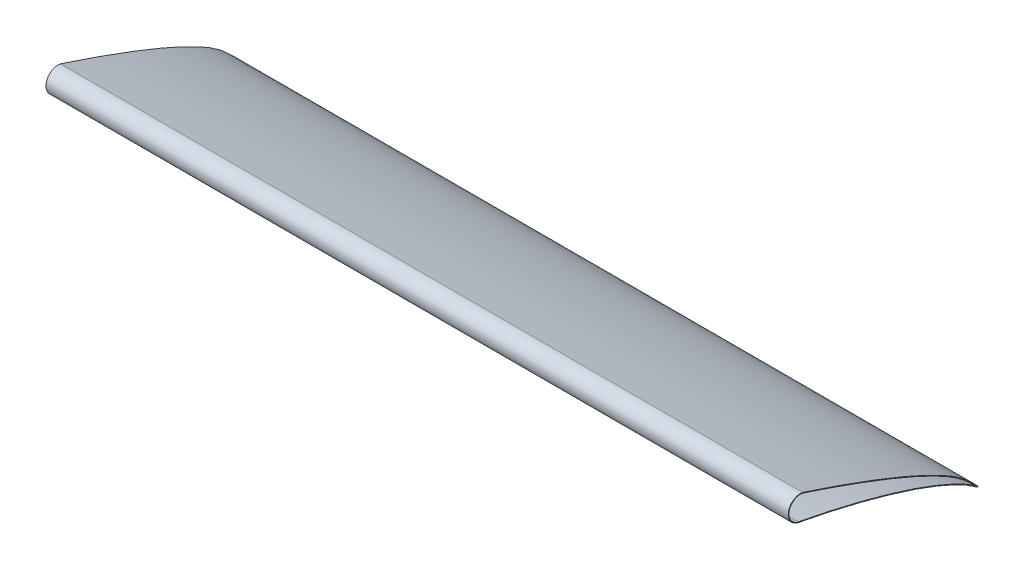
ISO-10303-21;
HEADER;
FILE_DESCRIPTION(('STEP AP214'),'2;1');
FILE_NAME('part.step','',(''),(''),'','','');
FILE_SCHEMA(('AUTOMOTIVE_DESIGN { 1 0 10303 214 1 1 1 1 }'));
ENDSEC;
DATA;
#1=APPLICATION_CONTEXT('core data for automotive mechanical design processes');
#2=APPLICATION_PROTOCOL_DEFINITION('international standard','automotive_design',2000,#1);
#3=PRODUCT_CONTEXT('',#1,'mechanical');
#4=PRODUCT('Part','Part','',(#3));
#5=PRODUCT_RELATED_PRODUCT_CATEGORY('part','',(#4));
#6=PRODUCT_DEFINITION_FORMATION('','',#4);
#7=PRODUCT_DEFINITION_CONTEXT('part definition',#1,'design');
#8=PRODUCT_DEFINITION('design','',#6,#7);
#9=PRODUCT_DEFINITION_SHAPE('','',#8);
#10=(LENGTH_UNIT() NAMED_UNIT(*) SI_UNIT(.MILLI.,.METRE.));
#11=(NAMED_UNIT(*) PLANE_ANGLE_UNIT() SI_UNIT($,.RADIAN.));
#12=(NAMED_UNIT(*) SI_UNIT($,.STERADIAN.) SOLID_ANGLE_UNIT());
#13=UNCERTAINTY_MEASURE_WITH_UNIT(LENGTH_MEASURE(1.E-05),#10,'distance_accuracy_value','');
#14=(GEOMETRIC_REPRESENTATION_CONTEXT(3) GLOBAL_UNCERTAINTY_ASSIGNED_CONTEXT((#13)) GLOBAL_UNIT_ASSIGNED_CONTEXT((#10,
#11,#12)) REPRESENTATION_CONTEXT('',''));
#15=CARTESIAN_POINT('',(0.,0.,0.));
#16=DIRECTION('',(0.,0.,1.));
#17=DIRECTION('',(1.,0.,0.));
#18=AXIS2_PLACEMENT_3D('',#15,#16,#17);
#19=CARTESIAN_POINT('',(764.54,-47.1529999413381,-645.006255561596));
#20=CARTESIAN_POINT('',(764.54,-46.8184129896161,-644.788009956468));
#21=CARTESIAN_POINT('',(764.54,-43.1306984629148,-640.701877001338));
#22=CARTESIAN_POINT('',(764.54,-39.4979946661954,-637.266948450529));
#23=CARTESIAN_POINT('',(764.54,-34.816728887082,-631.439943114749));
#24=CARTESIAN_POINT('',(764.54,-30.6051920119271,-624.753246516577));
#25=CARTESIAN_POINT('',(764.54,-26.2269590885202,-616.590234045585));
#26=CARTESIAN_POINT('',(764.54,-21.5976951529234,-606.898034971643));
#27=CARTESIAN_POINT('',(764.54,-16.6662217200038,-595.54713057427));
#28=CARTESIAN_POINT('',(764.54,-11.5121807979911,-582.685138375436));
#29=CARTESIAN_POINT('',(764.54,-6.23597283905796,-568.6038313187));
#30=CARTESIAN_POINT('',(764.54,-0.949303953276355,-553.667863853133));
#31=CARTESIAN_POINT('',(764.54,4.24867865050638,-538.206016680504));
#32=CARTESIAN_POINT('',(764.54,9.28277497005098,-522.465374532042));
#33=CARTESIAN_POINT('',(764.54,14.0946613985757,-506.597856331795));
#34=CARTESIAN_POINT('',(764.54,18.646906804061,-490.673471292505));
#35=CARTESIAN_POINT('',(764.54,22.9205089715268,-474.696934331045));
#36=CARTESIAN_POINT('',(764.54,26.91891487963,-458.629391952476));
#37=CARTESIAN_POINT('',(764.54,30.6578125592773,-442.405486907504));
#38=CARTESIAN_POINT('',(764.54,34.1705436576163,-425.949677688687));
#39=CARTESIAN_POINT('',(764.54,37.4977537886313,-409.193354533909));
#40=CARTESIAN_POINT('',(764.54,40.6930315626959,-392.099017640712));
#41=CARTESIAN_POINT('',(764.54,43.806237245543,-374.683246306306));
#42=CARTESIAN_POINT('',(764.54,46.874099431523,-357.03326536789));
#43=CARTESIAN_POINT('',(764.54,49.9022352532873,-339.309521150858));
#44=CARTESIAN_POINT('',(764.54,52.8613295143793,-321.730739173725));
#45=CARTESIAN_POINT('',(764.54,55.6750799388608,-304.550789958391));
#46=CARTESIAN_POINT('',(764.54,58.2441239309724,-288.040868648024));
#47=CARTESIAN_POINT('',(764.54,60.4580640802467,-272.443246647622));
#48=CARTESIAN_POINT('',(764.54,62.186715094106,-257.883007269268));
#49=CARTESIAN_POINT('',(764.54,63.3052473833036,-244.324039865457));
#50=CARTESIAN_POINT('',(764.54,63.7580770949073,-231.619659759733));
#51=CARTESIAN_POINT('',(764.54,63.5460195668556,-219.604957351917));
#52=CARTESIAN_POINT('',(764.54,62.6730635261331,-208.152298555875));
#53=CARTESIAN_POINT('',(764.54,61.1482744177689,-197.181322999887));
#54=CARTESIAN_POINT('',(764.54,58.9873404123107,-186.651773362443));
#55=CARTESIAN_POINT('',(764.54,56.2199721328174,-176.559997159896));
#56=CARTESIAN_POINT('',(764.54,52.881387141576,-166.942351020571));
#57=CARTESIAN_POINT('',(764.54,49.0504929712525,-157.873016706743));
#58=CARTESIAN_POINT('',(764.54,44.852310699452,-149.46664758464));
#59=CARTESIAN_POINT('',(764.54,40.46695814702,-141.853978947899));
#60=CARTESIAN_POINT('',(764.54,36.0850702190668,-135.147162117547));
#61=CARTESIAN_POINT('',(764.54,31.8729591824074,-129.387856040399));
#62=CARTESIAN_POINT('',(764.54,27.9151272600017,-124.548517842199));
#63=CARTESIAN_POINT('',(764.54,24.2325830860826,-120.541805747626));
#64=CARTESIAN_POINT('',(764.54,20.8130756742838,-117.252298406315));
#65=CARTESIAN_POINT('',(764.54,17.6401364072634,-114.558316512703));
#66=CARTESIAN_POINT('',(764.54,14.6947160118963,-112.353345163792));
#67=CARTESIAN_POINT('',(764.54,11.9535346341336,-110.555147126191));
#68=CARTESIAN_POINT('',(764.54,9.3931319857351,-109.100632431871));
#69=CARTESIAN_POINT('',(764.54,6.98852010711054,-107.949100641777));
#70=CARTESIAN_POINT('',(764.54,4.72084679731322,-107.067094982468));
#71=CARTESIAN_POINT('',(764.54,2.57320803774997,-106.438867949493));
#72=CARTESIAN_POINT('',(764.54,0.522315990334814,-106.057904943654));
#73=CARTESIAN_POINT('',(764.54,-1.4744993385527,-105.940192606176));
#74=CARTESIAN_POINT('',(764.54,-3.45401879542511,-106.208863531927));
#75=CARTESIAN_POINT('',(764.54,-5.27778203111289,-107.198129964763));
#76=CARTESIAN_POINT('',(764.54,-6.60555803889911,-108.898568130463));
#77=CARTESIAN_POINT('',(764.54,-7.51930683506491,-110.997800005891));
#78=CARTESIAN_POINT('',(764.54,-8.21118510611895,-113.419231546304));
#79=CARTESIAN_POINT('',(764.54,-8.77087461847364,-116.191322027118));
#80=CARTESIAN_POINT('',(764.54,-9.25491154756014,-119.392616546927));
#81=CARTESIAN_POINT('',(764.54,-9.69487553766679,-123.148071420133));
#82=CARTESIAN_POINT('',(764.54,-10.0952008259956,-127.643208841774));
#83=CARTESIAN_POINT('',(764.54,-10.4568280036261,-133.144545660416));
#84=CARTESIAN_POINT('',(764.54,-10.7691817623975,-140.01723365371));
#85=CARTESIAN_POINT('',(764.54,-11.010880296537,-148.675291787275));
#86=CARTESIAN_POINT('',(764.54,-11.1538134096261,-159.393445292688));
#87=CARTESIAN_POINT('',(764.54,-11.1322112495051,-172.099403693975));
#88=CARTESIAN_POINT('',(764.54,-10.8228945304688,-186.422500355236));
#89=CARTESIAN_POINT('',(764.54,-10.1212020176183,-201.960353907518));
#90=CARTESIAN_POINT('',(764.54,-9.0693879399111,-218.458739251688));
#91=CARTESIAN_POINT('',(764.54,-7.81124942101105,-235.740022213801));
#92=CARTESIAN_POINT('',(764.54,-6.44542220841076,-253.568303180533));
#93=CARTESIAN_POINT('',(764.54,-5.03382838171823,-271.65108974034));
#94=CARTESIAN_POINT('',(764.54,-3.63687971673737,-289.732991130569));
#95=CARTESIAN_POINT('',(764.54,-2.3125169514345,-307.638722864199));
#96=CARTESIAN_POINT('',(764.54,-1.10651638675471,-325.286307147841));
#97=CARTESIAN_POINT('',(764.54,-0.0662737166827977,-342.652435014441));
#98=CARTESIAN_POINT('',(764.54,0.773081287344189,-359.740128928665));
#99=CARTESIAN_POINT('',(764.54,1.37440620042548,-376.564409300323));
#100=CARTESIAN_POINT('',(764.54,1.70781888289015,-393.150169947285));
#101=CARTESIAN_POINT('',(764.54,1.75165040824774,-409.522858559904));
#102=CARTESIAN_POINT('',(764.54,1.48275855982936,-425.70995366449));
#103=CARTESIAN_POINT('',(764.54,0.888689421513576,-441.73383152197));
#104=CARTESIAN_POINT('',(764.54,-0.0466079173790058,-457.617389676548));
#105=CARTESIAN_POINT('',(764.54,-1.3317667080149,-473.377742702764));
#106=CARTESIAN_POINT('',(764.54,-2.97531977636997,-489.029743962823));
#107=CARTESIAN_POINT('',(764.54,-4.97914261694881,-504.575689139233));
#108=CARTESIAN_POINT('',(764.54,-7.34483277729503,-520.006592123799));
#109=CARTESIAN_POINT('',(764.54,-10.064545431703,-535.287551638364));
#110=CARTESIAN_POINT('',(764.54,-13.1267972971055,-550.344891007504));
#111=CARTESIAN_POINT('',(764.54,-16.4920742497173,-565.042082165484));
#112=CARTESIAN_POINT('',(764.54,-20.1085820143676,-579.151728774344));
#113=CARTESIAN_POINT('',(764.54,-23.8909030748361,-592.381523343565));
#114=CARTESIAN_POINT('',(764.54,-27.7206085395647,-604.391603146741));
#115=CARTESIAN_POINT('',(764.54,-31.5911859545367,-615.041484305705));
#116=CARTESIAN_POINT('',(764.54,-35.2482553349965,-624.006670800554));
#117=CARTESIAN_POINT('',(764.54,-39.3296543312368,-632.144488556374));
#118=CARTESIAN_POINT('',(764.54,-41.9859552947128,-637.598909850903));
#119=CARTESIAN_POINT('',(764.54,-47.7362536832473,-645.386702453477));
#120=CARTESIAN_POINT('',(764.54,-47.1529999413381,-645.006255561596));
#121=B_SPLINE_CURVE_WITH_KNOTS('',3,(#19,#20,#21,#22,#23,#24,#25,#26,#27,#28,#29,#30,#31,#32,
#33,#34,#35,#36,#37,#38,#39,#40,#41,#42,#43,#44,#45,#46,#47,#48,#49,#50,#51,#52,#53,#54,#55,#56,
#57,#58,#59,#60,#61,#62,#63,#64,#65,#66,#67,#68,#69,#70,#71,#72,#73,#74,#75,#76,#77,#78,#79,#80,
#81,#82,#83,#84,#85,#86,#87,#88,#89,#90,#91,#92,#93,#94,#95,#96,#97,#98,#99,#100,#101,#102,#103,
#104,#105,#106,#107,#108,#109,#110,#111,#112,#113,#114,#115,#116,#117,#118,#119,#120),
.UNSPECIFIED.,.T.,.F.,(4,1,1,1,1,1,1,1,1,1,1,1,1,1,1,1,1,1,1,1,1,1,1,1,1,1,1,1,1,1,1,1,1,1,1,1,
1,1,1,1,1,1,1,1,1,1,1,1,1,1,1,1,1,1,1,1,1,1,1,1,1,1,1,1,1,1,1,1,1,1,1,1,1,1,1,1,1,1,1,1,1,1,1,1,
1,1,1,1,1,1,1,1,1,1,1,1,1,1,1,4),(0.,0.00393243627204213,0.00966229958679102,0.0158580743520423,
0.0227759172876729,0.0308105377004699,0.040258451968964,0.0512101553734172,0.0635309254201197,
0.0769094272086791,0.0909824552528969,0.105438882288591,0.12005583883515,0.134694664133086,
0.149296508411322,0.163863463798656,0.178438522119036,0.193091444582364,0.207900805868289,
0.222945458506345,0.238278447799781,0.253900272542151,0.269742654955101,0.285665129167613,
0.301461442535721,0.316895213216797,0.331713796573279,0.345657403328602,0.358564777269519,
0.370492871938983,0.381634254168821,0.392176896215565,0.402261883473533,0.411997635220679,
0.421456053439548,0.430674693489293,0.439657230914039,0.448365559098678,0.456698480814776,
0.464496219365899,0.471591337620358,0.477879417429047,0.48336118210472,0.488119435275692,
0.492265586775502,0.495903994580303,0.499122498538387,0.501991801966659,0.504570111683674,
0.506905890065342,0.509037948269525,0.510999246223084,0.512816550490772,0.514543833236563,
0.516275553758877,0.518034092640334,0.519877573234174,0.521868418874192,0.524063688354164,
0.526527900779738,0.529344621975955,0.532625657243875,0.536528130378445,0.541280690338968,
0.547207803698655,0.554725076607436,0.564190483291477,0.575560473512985,0.588332609287316,
0.602082710528579,0.616698831029917,0.632060539263214,0.647915036171109,0.663995366327359,
0.680037668885217,0.695886794717843,0.71148786711782,0.726826596533268,0.741904372240097,
0.756740718002256,0.771356109874098,0.785782995965424,0.800046572279944,0.814176416038573,
0.828194452350353,0.842130217180752,0.855999547680395,0.869820095466402,0.883587785644631,
0.897289500021316,0.910871530658389,0.924228261772924,0.937166440672137,0.949399836984198,
0.960605240168519,0.970553551460057,0.979208760733245,0.986686331825572,0.993144956314993,1.),.UNSPECIFIED.);
#122=DIRECTION('',(-1.,0.,0.));
#123=VECTOR('',#122,1.);
#124=SURFACE_OF_LINEAR_EXTRUSION('',#121,#123);
#125=DIRECTION('',(1.,0.,0.));
#126=VECTOR('',#125,1.);
#127=CARTESIAN_POINT('',(307.33,5.15406600738185,-535.301768996159));
#128=LINE('',#127,#126);
#129=CARTESIAN_POINT('',(307.34,5.15406600738085,-535.301768996162));
#130=VERTEX_POINT('',#129);
#131=CARTESIAN_POINT('',(764.54,5.15406600738099,-535.301768996161));
#132=VERTEX_POINT('',#131);
#133=EDGE_CURVE('E145',#130,#132,#128,.T.);
#134=ORIENTED_EDGE('',*,*,#133,.T.);
#135=CARTESIAN_POINT('',(764.54,-45.3771271395738,-643.20196177503));
#136=VERTEX_POINT('',#135);
#137=EDGE_CURVE('E155',#136,#132,#121,.T.);
#138=ORIENTED_EDGE('',*,*,#137,.F.);
#139=DIRECTION('',(-1.,0.,0.));
#140=VECTOR('',#139,1.);
#141=CARTESIAN_POINT('',(764.54,-45.3771271395738,-643.20196177503));
#142=LINE('',#141,#140);
#143=CARTESIAN_POINT('',(307.34,-45.3771271395406,-643.201961774998));
#144=VERTEX_POINT('',#143);
#145=EDGE_CURVE('E136',#136,#144,#142,.T.);
#146=ORIENTED_EDGE('',*,*,#145,.T.);
#147=CARTESIAN_POINT('',(307.34,-46.8489354685635,-644.740736110317));
#148=CARTESIAN_POINT('',(307.34,-46.5180751287745,-644.420979690167));
#149=CARTESIAN_POINT('',(307.34,-45.5965792353619,-643.441416831579));
#150=CARTESIAN_POINT('',(307.34,-43.1964585909459,-640.850684576139));
#151=CARTESIAN_POINT('',(307.34,-41.3512975641284,-639.019352002714));
#152=CARTESIAN_POINT('',(307.34,-38.5451961095666,-636.080952496578));
#153=CARTESIAN_POINT('',(307.34,-36.5008641143958,-633.536270351609));
#154=CARTESIAN_POINT('',(307.34,-33.5552586122208,-629.437094927578));
#155=CARTESIAN_POINT('',(307.34,-31.3912407268852,-625.996253432822));
#156=CARTESIAN_POINT('',(307.34,-28.6535702116708,-621.114538075786));
#157=CARTESIAN_POINT('',(307.34,-25.6950879725233,-615.456264660556));
#158=CARTESIAN_POINT('',(307.34,-23.4850897501488,-610.849636008414));
#159=CARTESIAN_POINT('',(307.34,-20.2703863519754,-603.842932777483));
#160=CARTESIAN_POINT('',(307.34,-18.0193080212363,-598.6615655308));
#161=CARTESIAN_POINT('',(307.34,-14.6560264223192,-590.530655806574));
#162=CARTESIAN_POINT('',(307.34,-11.8109066918377,-583.369653581975));
#163=CARTESIAN_POINT('',(307.34,-8.8082789822882,-575.46888154581));
#164=CARTESIAN_POINT('',(307.34,-5.26669595491397,-565.860075771104));
#165=CARTESIAN_POINT('',(307.34,-2.81895971659347,-558.950040258737));
#166=CARTESIAN_POINT('',(307.34,0.702202402456493,-548.755315885315));
#167=CARTESIAN_POINT('',(307.34,3.20061997796362,-541.323557514714));
#168=CARTESIAN_POINT('',(307.34,6.59502484470291,-530.869447521932));
#169=CARTESIAN_POINT('',(307.34,9.79619154958835,-520.753668360204));
#170=CARTESIAN_POINT('',(307.34,12.3619590180452,-512.311558632767));
#171=CARTESIAN_POINT('',(307.34,15.4921098623097,-501.709388020695));
#172=CARTESIAN_POINT('',(307.34,17.9069340604933,-493.261998456034));
#173=CARTESIAN_POINT('',(307.34,20.8008917130223,-482.620962386919));
#174=CARTESIAN_POINT('',(307.34,23.6003143241723,-471.965145322161));
#175=CARTESIAN_POINT('',(307.34,25.7929086813406,-463.154233283087));
#176=CARTESIAN_POINT('',(307.34,28.353325740555,-452.405165563558));
#177=CARTESIAN_POINT('',(307.34,30.6148944277358,-442.534227501143));
#178=CARTESIAN_POINT('',(307.34,32.7718784757674,-432.501892119331));
#179=CARTESIAN_POINT('',(307.34,35.0638968914343,-421.450618450534));
#180=CARTESIAN_POINT('',(307.34,36.876436940818,-412.322398229232));
#181=CARTESIAN_POINT('',(307.34,39.0217458199563,-401.040187564366));
#182=CARTESIAN_POINT('',(307.34,41.1517150509352,-389.533068725079));
#183=CARTESIAN_POINT('',(307.34,42.779996653935,-380.424200582474));
#184=CARTESIAN_POINT('',(307.34,44.8445490418792,-368.70964570025));
#185=CARTESIAN_POINT('',(307.34,46.4294291084398,-359.589497527944));
#186=CARTESIAN_POINT('',(307.34,48.4330557712671,-347.90866031796));
#187=CARTESIAN_POINT('',(307.34,50.4446482215248,-336.08726512624));
#188=CARTESIAN_POINT('',(307.34,51.9151861235999,-327.35139431956));
#189=CARTESIAN_POINT('',(307.34,53.8483694089172,-315.704158026325));
#190=CARTESIAN_POINT('',(307.34,55.24927189864,-307.145601137022));
#191=CARTESIAN_POINT('',(307.34,57.0085341485594,-295.981367192296));
#192=CARTESIAN_POINT('',(307.34,58.6429244389458,-285.231244558151));
#193=CARTESIAN_POINT('',(307.34,59.7885611932577,-277.160019575226));
#194=CARTESIAN_POINT('',(307.34,61.0932833860575,-267.092863559187));
#195=CARTESIAN_POINT('',(307.34,62.0131881201954,-259.315219459929));
#196=CARTESIAN_POINT('',(307.34,62.8307096660101,-250.076436557802));
#197=CARTESIAN_POINT('',(307.34,63.4104153411277,-241.373496478169));
#198=CARTESIAN_POINT('',(307.34,63.6684283618713,-234.134802983115));
#199=CARTESIAN_POINT('',(307.34,63.6577542625057,-225.935593803252));
#200=CARTESIAN_POINT('',(307.34,63.4342298159956,-218.138342982156));
#201=CARTESIAN_POINT('',(307.34,62.9220014793444,-211.418214944007));
#202=CARTESIAN_POINT('',(307.34,62.0917670224829,-203.969825256883));
#203=CARTESIAN_POINT('',(307.34,61.156001626319,-197.410540265928));
#204=CARTESIAN_POINT('',(307.34,59.8160892048655,-190.69000475967));
#205=CARTESIAN_POINT('',(307.34,58.2089098307214,-183.813066538768));
#206=CARTESIAN_POINT('',(307.34,56.7043554017292,-178.326400129222));
#207=CARTESIAN_POINT('',(307.34,54.5624588583164,-171.785107142956));
#208=CARTESIAN_POINT('',(307.34,52.2717761898825,-165.499146046362));
#209=CARTESIAN_POINT('',(307.34,50.2640746402727,-160.746073853228));
#210=CARTESIAN_POINT('',(307.34,47.5636228690918,-154.895733181123));
#211=CARTESIAN_POINT('',(307.34,45.4777849042349,-150.72250598631));
#212=CARTESIAN_POINT('',(307.34,42.5236449797171,-145.424245000554));
#213=CARTESIAN_POINT('',(307.34,39.6443688317309,-140.595669987702));
#214=CARTESIAN_POINT('',(307.34,37.3912467258618,-137.146365822256));
#215=CARTESIAN_POINT('',(307.34,34.5066202780384,-132.988915039367));
#216=CARTESIAN_POINT('',(307.34,32.3711918225743,-130.069099779553));
#217=CARTESIAN_POINT('',(307.34,29.5888887795659,-126.595067118445));
#218=CARTESIAN_POINT('',(307.34,27.0831194328775,-123.643269821733));
#219=CARTESIAN_POINT('',(307.34,24.9467190714752,-121.318805874361));
#220=CARTESIAN_POINT('',(307.34,22.5655865427282,-118.938183732249));
#221=CARTESIAN_POINT('',(307.34,20.4219556852453,-116.920218249708));
#222=CARTESIAN_POINT('',(307.34,18.350327642243,-115.161303890345));
#223=CARTESIAN_POINT('',(307.34,16.309450284396,-113.5621514899));
#224=CARTESIAN_POINT('',(307.34,14.5143375951564,-112.239750512852));
#225=CARTESIAN_POINT('',(307.34,12.8300163817513,-111.130113734145));
#226=CARTESIAN_POINT('',(307.34,11.6587021136608,-110.413343820119));
#227=CARTESIAN_POINT('',(307.34,10.7588577613882,-109.876474548087));
#228=CARTESIAN_POINT('',(307.34,9.13294863281832,-108.97603461016));
#229=CARTESIAN_POINT('',(307.34,7.04396698068917,-107.975653300089));
#230=CARTESIAN_POINT('',(307.34,5.46993998019822,-107.358452835382));
#231=CARTESIAN_POINT('',(307.34,4.00519825955557,-106.857753557833));
#232=CARTESIAN_POINT('',(307.34,2.57320803774997,-106.438867949493));
#233=CARTESIAN_POINT('',(307.34,0.522315990334814,-106.057904943654));
#234=CARTESIAN_POINT('',(307.34,-1.4744993385527,-105.940192606176));
#235=CARTESIAN_POINT('',(307.34,-2.84557432610392,-106.126282207317));
#236=CARTESIAN_POINT('',(307.34,-4.09908411151578,-106.558767210051));
#237=CARTESIAN_POINT('',(307.34,-5.31453809206499,-107.245202218288));
#238=CARTESIAN_POINT('',(307.34,-6.60555803889911,-108.898568130463));
#239=CARTESIAN_POINT('',(307.34,-7.51930683506491,-110.997800005891));
#240=CARTESIAN_POINT('',(307.34,-8.09536776940686,-113.013894706322));
#241=CARTESIAN_POINT('',(307.34,-8.47666707325876,-114.734139218667));
#242=CARTESIAN_POINT('',(307.34,-8.84724991141747,-116.696448376075));
#243=CARTESIAN_POINT('',(307.34,-9.25491154756014,-119.392616546927));
#244=CARTESIAN_POINT('',(307.34,-9.6625054699151,-122.871766241941));
#245=CARTESIAN_POINT('',(307.34,-9.91112736145998,-125.576300897438));
#246=CARTESIAN_POINT('',(307.34,-10.173733116757,-128.837899421858));
#247=CARTESIAN_POINT('',(307.34,-10.4568280036261,-133.144545660416));
#248=CARTESIAN_POINT('',(307.34,-10.6449037091707,-137.282756285479));
#249=CARTESIAN_POINT('',(307.34,-10.8346367511221,-142.361944181339));
#250=CARTESIAN_POINT('',(307.34,-10.9723705316371,-147.338233166872));
#251=CARTESIAN_POINT('',(307.34,-11.0772611886342,-153.653008818323));
#252=CARTESIAN_POINT('',(307.34,-11.1458960271132,-161.066720821696));
#253=CARTESIAN_POINT('',(307.34,-11.1412079668867,-166.807714522238));
#254=CARTESIAN_POINT('',(307.34,-11.0493929165808,-175.934356397132));
#255=CARTESIAN_POINT('',(307.34,-10.927836027078,-181.563121255415));
#256=CARTESIAN_POINT('',(307.34,-10.5897850100902,-191.584336234846));
#257=CARTESIAN_POINT('',(307.34,-10.2998547358607,-197.922184505404));
#258=CARTESIAN_POINT('',(307.34,-9.7175637172135,-208.291682191563));
#259=CARTESIAN_POINT('',(307.34,-9.22513392389633,-215.90653050468));
#260=CARTESIAN_POINT('',(307.34,-8.51531946870702,-226.069200172663));
#261=CARTESIAN_POINT('',(307.34,-7.84688831748775,-235.165686994193));
#262=CARTESIAN_POINT('',(307.34,-7.11452963116846,-244.834376209537));
#263=CARTESIAN_POINT('',(307.34,-6.27665569457217,-255.714610502692));
#264=CARTESIAN_POINT('',(307.34,-5.59614972107642,-264.447645969645));
#265=CARTESIAN_POINT('',(307.34,-4.65495952484421,-276.555113403886));
#266=CARTESIAN_POINT('',(307.34,-4.02294785346407,-284.735781030299));
#267=CARTESIAN_POINT('',(307.34,-3.11726553211509,-296.758311109803));
#268=CARTESIAN_POINT('',(307.34,-2.40297505267292,-306.476627734492));
#269=CARTESIAN_POINT('',(307.34,-1.64814085994517,-317.360636281137));
#270=CARTESIAN_POINT('',(307.34,-0.882124068142321,-329.032380837585));
#271=CARTESIAN_POINT('',(307.34,-0.328397029265224,-338.276468623053));
#272=CARTESIAN_POINT('',(307.34,0.282817815353455,-349.759283986406));
#273=CARTESIAN_POINT('',(307.34,0.804905519601347,-360.736212942274));
#274=CARTESIAN_POINT('',(307.34,1.16561355299803,-370.722665571696));
#275=CARTESIAN_POINT('',(307.34,1.48071069746524,-381.852573297456));
#276=CARTESIAN_POINT('',(307.34,1.68107503528884,-391.819785476559));
#277=CARTESIAN_POINT('',(307.34,1.73365135764192,-402.799550427509));
#278=CARTESIAN_POINT('',(307.34,1.68315773744507,-413.646067882802));
#279=CARTESIAN_POINT('',(307.34,1.51479967306971,-423.781101784713));
#280=CARTESIAN_POINT('',(307.34,1.15651558385911,-434.509733457174));
#281=CARTESIAN_POINT('',(307.34,0.68805835184342,-445.141021011565));
#282=CARTESIAN_POINT('',(307.34,0.0918643468985341,-455.265803532774));
#283=CARTESIAN_POINT('',(307.34,-0.714129095763692,-465.803436023873));
#284=CARTESIAN_POINT('',(307.34,-1.63600052128334,-476.275043751519));
#285=CARTESIAN_POINT('',(307.34,-2.67799098692464,-486.198201327143));
#286=CARTESIAN_POINT('',(307.34,-3.94971742169681,-496.589260736221));
#287=CARTESIAN_POINT('',(307.34,-5.33953777697722,-506.926471521357));
#288=CARTESIAN_POINT('',(307.34,-6.79806173419696,-516.440118769747));
#289=CARTESIAN_POINT('',(307.34,-8.53247079141915,-526.679447207359));
#290=CARTESIAN_POINT('',(307.34,-10.3778919836615,-536.828301903322));
#291=CARTESIAN_POINT('',(307.34,-12.1873527621983,-545.725566470421));
#292=CARTESIAN_POINT('',(307.34,-14.3480261795174,-555.678370119386));
#293=CARTESIAN_POINT('',(307.34,-16.2914652017081,-564.132046476375));
#294=CARTESIAN_POINT('',(307.34,-18.6455310254729,-573.443699435702));
#295=CARTESIAN_POINT('',(307.34,-21.1051915971516,-582.637667655565));
#296=CARTESIAN_POINT('',(307.34,-23.1428044760804,-589.76482565428));
#297=CARTESIAN_POINT('',(307.34,-25.7541731398798,-598.224798337464));
#298=CARTESIAN_POINT('',(307.34,-28.1876557746557,-605.660356978736));
#299=CARTESIAN_POINT('',(307.34,-30.4080391460753,-611.786059713245));
#300=CARTESIAN_POINT('',(307.34,-32.9220925658674,-618.304158522815));
#301=CARTESIAN_POINT('',(307.34,-34.7994867456047,-622.906529217672));
#302=CARTESIAN_POINT('',(307.34,-37.5846253430109,-628.665111044426));
#303=CARTESIAN_POINT('',(307.34,-39.8760981003344,-633.266550616137));
#304=CARTESIAN_POINT('',(307.34,-41.1124416316672,-635.805245808202));
#305=CARTESIAN_POINT('',(307.34,-44.474476816495,-640.91782234182));
#306=CARTESIAN_POINT('',(307.34,-47.2525654573774,-644.732525783319));
#307=CARTESIAN_POINT('',(307.34,-47.2478173623462,-645.104820175898));
#308=CARTESIAN_POINT('',(307.34,-46.9854295705903,-644.872649368531));
#309=CARTESIAN_POINT('',(307.34,-46.8489354685635,-644.740736110317));
#310=B_SPLINE_CURVE_WITH_KNOTS('',3,(#147,#148,#149,#150,#151,#152,#153,#154,#155,#156,#157,
#158,#159,#160,#161,#162,#163,#164,#165,#166,#167,#168,#169,#170,#171,#172,#173,#174,#175,#176,
#177,#178,#179,#180,#181,#182,#183,#184,#185,#186,#187,#188,#189,#190,#191,#192,#193,#194,#195,
#196,#197,#198,#199,#200,#201,#202,#203,#204,#205,#206,#207,#208,#209,#210,#211,#212,#213,#214,
#215,#216,#217,#218,#219,#220,#221,#222,#223,#224,#225,#226,#227,#228,#229,#230,#231,#232,#233,
#234,#235,#236,#237,#238,#239,#240,#241,#242,#243,#244,#245,#246,#247,#248,#249,#250,#251,#252,
#253,#254,#255,#256,#257,#258,#259,#260,#261,#262,#263,#264,#265,#266,#267,#268,#269,#270,#271,
#272,#273,#274,#275,#276,#277,#278,#279,#280,#281,#282,#283,#284,#285,#286,#287,#288,#289,#290,
#291,#292,#293,#294,#295,#296,#297,#298,#299,#300,#301,#302,#303,#304,#305,#306,#307,#308,#309),
.UNSPECIFIED.,.T.,.F.,(4,1,1,1,1,1,1,1,1,1,1,1,1,1,1,1,1,1,1,1,1,1,1,1,1,1,1,1,1,1,1,1,1,1,1,1,
1,1,1,1,1,1,1,1,1,1,1,1,1,1,1,1,1,1,1,1,1,1,1,1,1,1,1,1,1,1,1,1,1,1,1,1,1,1,1,1,1,1,1,1,1,1,1,1,
1,1,1,1,1,1,1,1,1,1,1,1,1,1,1,1,1,1,1,1,1,1,1,1,1,1,1,1,1,1,1,1,1,1,1,1,1,1,1,1,1,1,1,1,1,1,1,1,
1,1,1,1,1,1,1,1,1,1,1,1,1,1,1,1,1,1,1,1,1,1,1,1,1,1,1,1,4),(0.,0.00179673967374985,
0.00319120397898173,0.00702650031991195,0.00892106729373062,0.0151168420589819,
0.0152555419847805,0.0220346849946125,0.0259934467816502,0.0300693054074095,0.0388760158523666,
0.0395172196759036,0.0504689230803568,0.0538119486462859,0.0627896931270593,0.0708510601560436,
0.0761681949156187,0.0898767003993281,0.0902412229598365,0.104697649995531,0.110615083219077,
0.119314606542089,0.132762672881246,0.133953431840026,0.148555276118261,0.156001251517485,
0.163122231505596,0.177697289825976,0.18001695480728,0.192350212289303,0.204482886169599,
0.207159573575229,0.222204226213284,0.229099081065054,0.237537215506721,0.25315904024909,
0.253575142659477,0.269001422662041,0.277644661717655,0.284923896874552,0.300720210242661,
0.301077380646332,0.316153980923736,0.323659984785992,0.330972564280218,0.344916171035542,
0.345222529794538,0.357823544976459,0.365629830246867,0.369751639645922,0.380893021875761,
0.384781321680919,0.391435663922505,0.401520651180473,0.402597779149302,0.411256402927619,
0.41903674619514,0.420714821146488,0.429933461196233,0.43407463165222,0.438915998620978,
0.447624326805617,0.447713222492143,0.455957248521716,0.459957445662298,0.463754987072838,
0.470824458666401,0.470850105327298,0.477138185135986,0.480388493871821,0.48261994981166,
0.487378202982632,0.488734522035891,0.491524354482442,0.495162762287242,0.495918477509244,
0.498381266245326,0.501057923216228,0.501250569673599,0.502012975443328,0.503828879390614,
0.506164657772282,0.50813424202932,0.508296715976465,0.510258013930023,0.512075318197711,
0.513802600943502,0.515534321465816,0.51568914553996,0.517292860347273,0.519136340941113,
0.521127186581132,0.523322456061104,0.524673433316831,0.525786668486678,0.528603389682894,
0.531884424950815,0.53505113762107,0.535786898085385,0.540539458045908,0.546466571405594,
0.546743716771464,0.553983844314376,0.559634097634733,0.563449250998417,0.573594745559282,
0.574819241219924,0.587591376994256,0.588485829667591,0.601341478235518,0.604372163361145,
0.615957598736857,0.621525461333568,0.631319306970153,0.640083953687701,0.647173803878049,
0.660184307254768,0.663254134034298,0.679296436592157,0.681887832987821,0.695145562424782,
0.705072083624331,0.71074663482476,0.726085364240207,0.729567499617922,0.741163139947036,
0.755153294704907,0.755999485709196,0.770614877581037,0.781522151829193,0.785041763672363,
0.799305339986883,0.808332722340035,0.813435183745512,0.827453220057293,0.835158434071235,
0.841388984887692,0.855258315387334,0.861548530070094,0.869078863173342,0.882846553351571,
0.887005111701597,0.896548267728255,0.910130298365329,0.911019252538945,0.923487029479863,
0.933072055362697,0.936425208379077,0.948658604691138,0.952669069600879,0.959864007875458,
0.969355623621816,0.969812319166996,0.978467528440184,0.982744620270271,0.985945099532511,
0.992403724021932,0.99242165405872,0.998138910172408,0.99925876770694,1.),.UNSPECIFIED.);
#311=EDGE_CURVE('E208',#144,#130,#310,.T.);
#312=ORIENTED_EDGE('',*,*,#311,.T.);
#313=EDGE_LOOP('',(#134,#138,#146,#312));
#314=FACE_BOUND('',#313,.T.);
#315=ADVANCED_FACE('F40',(#314),#124,.F.);
#316=CARTESIAN_POINT('',(307.33,-2.22989347353399,-533.927634172709));
#317=DIRECTION('',(1.,0.,0.));
#318=DIRECTION('',(0.,0.,-1.));
#319=AXIS2_PLACEMENT_3D('',#316,#317,#318);
#320=CYLINDRICAL_SURFACE('',#319,7.51073259601374);
#321=CARTESIAN_POINT('',(307.34,-2.22989347353399,-533.927634172709));
#322=DIRECTION('',(1.,0.,0.));
#323=DIRECTION('',(0.,0.,-1.));
#324=AXIS2_PLACEMENT_3D('',#321,#322,#323);
#325=CIRCLE('',#324,7.51073259601374);
#326=CARTESIAN_POINT('',(307.34,-9.61385295444934,-532.553499349257));
#327=VERTEX_POINT('',#326);
#328=EDGE_CURVE('E148',#130,#327,#325,.T.);
#329=ORIENTED_EDGE('',*,*,#328,.T.);
#330=DIRECTION('',(1.,0.,0.));
#331=VECTOR('',#330,1.);
#332=CARTESIAN_POINT('',(307.33,-9.61385295444991,-532.55349934926));
#333=LINE('',#332,#331);
#334=CARTESIAN_POINT('',(764.54,-9.61385295444988,-532.55349934926));
#335=VERTEX_POINT('',#334);
#336=EDGE_CURVE('E142',#327,#335,#333,.T.);
#337=ORIENTED_EDGE('',*,*,#336,.T.);
#338=CARTESIAN_POINT('',(764.54,-2.22989347353399,-533.927634172709));
#339=DIRECTION('',(1.,0.,0.));
#340=DIRECTION('',(0.,0.,-1.));
#341=AXIS2_PLACEMENT_3D('',#338,#339,#340);
#342=CIRCLE('',#341,7.51073259601374);
#343=EDGE_CURVE('E206',#132,#335,#342,.T.);
#344=ORIENTED_EDGE('',*,*,#343,.F.);
#345=ORIENTED_EDGE('',*,*,#133,.F.);
#346=EDGE_LOOP('',(#329,#337,#344,#345));
#347=FACE_BOUND('',#346,.T.);
#348=ADVANCED_FACE('F167',(#347),#320,.T.);
#349=CARTESIAN_POINT('',(307.34,-45.8550044341258,-642.841558299702));
#350=VERTEX_POINT('',#349);
#351=EDGE_CURVE('E156',#327,#350,#310,.T.);
#352=ORIENTED_EDGE('',*,*,#351,.T.);
#353=DIRECTION('',(-1.,0.,0.));
#354=VECTOR('',#353,1.);
#355=CARTESIAN_POINT('',(764.54,-45.8550044341263,-642.841558299703));
#356=LINE('',#355,#354);
#357=CARTESIAN_POINT('',(764.54,-45.8550044341263,-642.841558299703));
#358=VERTEX_POINT('',#357);
#359=EDGE_CURVE('E139',#350,#358,#356,.F.);
#360=ORIENTED_EDGE('',*,*,#359,.T.);
#361=EDGE_CURVE('E149',#335,#358,#121,.T.);
#362=ORIENTED_EDGE('',*,*,#361,.F.);
#363=ORIENTED_EDGE('',*,*,#336,.F.);
#364=EDGE_LOOP('',(#352,#360,#362,#363));
#365=FACE_BOUND('',#364,.T.);
#366=ADVANCED_FACE('F164',(#365),#124,.F.);
#367=CARTESIAN_POINT('',(764.54,0.,0.));
#368=DIRECTION('',(1.,0.,0.));
#369=DIRECTION('',(0.,0.,-1.));
#370=AXIS2_PLACEMENT_3D('',#367,#368,#369);
#371=PLANE('',#370);
#372=CARTESIAN_POINT('',(764.54,-9.22060452567006,-532.626681814799));
#373=CARTESIAN_POINT('',(764.54,-10.9840538720429,-542.1026359192));
#374=CARTESIAN_POINT('',(764.54,-12.9596044356269,-551.530676271523));
#375=CARTESIAN_POINT('',(764.54,-16.2608105237867,-565.596409514394));
#376=CARTESIAN_POINT('',(764.54,-17.4182534552846,-570.272101698804));
#377=CARTESIAN_POINT('',(764.54,-19.8596127748865,-579.594915661834));
#378=CARTESIAN_POINT('',(764.54,-21.1427168189455,-584.241352766685));
#379=CARTESIAN_POINT('',(764.54,-23.8512973118202,-593.486462786453));
#380=CARTESIAN_POINT('',(764.54,-25.2735678636454,-598.087848354462));
#381=CARTESIAN_POINT('',(764.54,-27.560716669875,-604.942050295383));
#382=CARTESIAN_POINT('',(764.54,-28.3495699777005,-607.218541255787));
#383=CARTESIAN_POINT('',(764.54,-29.9846163839328,-611.753667249693));
#384=CARTESIAN_POINT('',(764.54,-30.8297828544134,-614.011221719374));
#385=CARTESIAN_POINT('',(764.54,-32.5787999190723,-618.495073039037));
#386=CARTESIAN_POINT('',(764.54,-33.4868284824953,-620.720740693359));
#387=CARTESIAN_POINT('',(764.54,-34.9399247144459,-624.015079135124));
#388=CARTESIAN_POINT('',(764.54,-35.440437958976,-625.105359868835));
#389=CARTESIAN_POINT('',(764.54,-36.4676336023969,-627.273228679302));
#390=CARTESIAN_POINT('',(764.54,-36.9929044697116,-628.351501382158));
#391=CARTESIAN_POINT('',(764.54,-38.0528294296223,-630.503495702343));
#392=CARTESIAN_POINT('',(764.54,-38.5871419034404,-631.577383012837));
#393=CARTESIAN_POINT('',(764.54,-39.3852032971377,-633.189866607683));
#394=CARTESIAN_POINT('',(764.54,-39.6522392228893,-633.726868616678));
#395=CARTESIAN_POINT('',(764.54,-40.203673603585,-634.792451398587));
#396=CARTESIAN_POINT('',(764.54,-40.4883128909552,-635.320915362096));
#397=CARTESIAN_POINT('',(764.54,-41.3768695215066,-636.889506633117));
#398=CARTESIAN_POINT('',(764.54,-42.0154842785273,-637.912804876724));
#399=CARTESIAN_POINT('',(764.54,-43.3516812239321,-639.930800769229));
#400=CARTESIAN_POINT('',(764.54,-44.0435528750602,-640.928268163354));
#401=CARTESIAN_POINT('',(764.54,-44.7350359675907,-641.925924017561));
#402=B_SPLINE_CURVE_WITH_KNOTS('',3,(#372,#373,#374,#375,#376,#377,#378,#379,#380,#381,#382,
#383,#384,#385,#386,#387,#388,#389,#390,#391,#392,#393,#394,#395,#396,#397,#398,#399,#400,#401),
.UNSPECIFIED.,.F.,.F.,(4,2,2,2,2,2,2,2,2,2,2,2,2,2,4),(0.,0.249999999999997,0.374999999999995,
0.499999999999993,0.624999999999992,0.687499999999992,0.749999999999993,0.812499999999993,
0.843749999999994,0.874999999999994,0.906249999999994,0.921874999999994,0.937499999999994,
0.968749999999997,1.),.UNSPECIFIED.);
#403=CARTESIAN_POINT('',(764.54,-9.22060452567007,-532.626681814799));
#404=VERTEX_POINT('',#403);
#405=CARTESIAN_POINT('',(764.54,-44.7350359675906,-641.925924017561));
#406=VERTEX_POINT('',#405);
#407=EDGE_CURVE('E57',#404,#406,#402,.T.);
#408=ORIENTED_EDGE('',*,*,#407,.F.);
#409=CARTESIAN_POINT('',(764.54,-2.22989347353399,-533.927634172709));
#410=DIRECTION('',(1.,0.,0.));
#411=DIRECTION('',(0.,0.,-1.));
#412=AXIS2_PLACEMENT_3D('',#409,#410,#411);
#413=CIRCLE('',#412,7.11073259601357);
#414=CARTESIAN_POINT('',(764.54,4.765477725178,-535.203290805287));
#415=VERTEX_POINT('',#414);
#416=EDGE_CURVE('E105',#415,#404,#413,.T.);
#417=ORIENTED_EDGE('',*,*,#416,.F.);
#418=CARTESIAN_POINT('',(764.54,-44.7350359675906,-641.925924017561));
#419=CARTESIAN_POINT('',(764.54,-44.3126907525488,-641.474235102643));
#420=CARTESIAN_POINT('',(764.54,-43.8867028442239,-641.025103664571));
#421=CARTESIAN_POINT('',(764.54,-43.0257084390836,-640.133172595542));
#422=CARTESIAN_POINT('',(764.54,-42.5910352557694,-639.690138950493));
#423=CARTESIAN_POINT('',(764.54,-41.285053393052,-638.362415723843));
#424=CARTESIAN_POINT('',(764.54,-40.4143635554812,-637.477291663263));
#425=CARTESIAN_POINT('',(764.54,-38.7657895772485,-635.641886142731));
#426=CARTESIAN_POINT('',(764.54,-37.978810356656,-634.697990193315));
#427=CARTESIAN_POINT('',(764.54,-36.4591709889007,-632.772061739522));
#428=CARTESIAN_POINT('',(764.54,-35.7271945560476,-631.789549210233));
#429=CARTESIAN_POINT('',(764.54,-33.613724608995,-628.784118227061));
#430=CARTESIAN_POINT('',(764.54,-32.3158855264311,-626.702467331173));
#431=CARTESIAN_POINT('',(764.54,-29.8432342621751,-622.45279031481));
#432=CARTESIAN_POINT('',(764.54,-28.667481420929,-620.285424616402));
#433=CARTESIAN_POINT('',(764.54,-26.3945047952252,-615.895559221504));
#434=CARTESIAN_POINT('',(764.54,-25.2960097690938,-613.673647473247));
#435=CARTESIAN_POINT('',(764.54,-23.1655116016768,-609.207780337066));
#436=CARTESIAN_POINT('',(764.54,-22.131996054492,-606.961143919923));
#437=CARTESIAN_POINT('',(764.54,-19.1022042207407,-600.190682055796));
#438=CARTESIAN_POINT('',(764.54,-17.1783975616533,-595.635563520333));
#439=CARTESIAN_POINT('',(764.54,-13.4576634567193,-586.470538773738));
#440=CARTESIAN_POINT('',(764.54,-11.6614848619146,-581.858990906538));
#441=CARTESIAN_POINT('',(764.54,-8.16346283939594,-572.60274593821));
#442=CARTESIAN_POINT('',(764.54,-6.46243524208884,-567.957722129473));
#443=CARTESIAN_POINT('',(764.54,-1.47143994835945,-553.983169827866));
#444=CARTESIAN_POINT('',(764.54,1.70715926097635,-544.614413718776));
#445=CARTESIAN_POINT('',(764.54,4.765477725178,-535.203290805287));
#446=B_SPLINE_CURVE_WITH_KNOTS('',3,(#418,#419,#420,#421,#422,#423,#424,#425,#426,#427,#428,
#429,#430,#431,#432,#433,#434,#435,#436,#437,#438,#439,#440,#441,#442,#443,#444,#445),
.UNSPECIFIED.,.F.,.F.,(4,2,2,2,2,2,2,2,2,2,2,2,2,4),(0.,0.0156249999999996,0.0312499999999992,
0.0624999999999986,0.0937499999999979,0.124999999999997,0.187499999999998,0.249999999999999,
0.3125,0.375000000000001,0.5,0.624999999999999,0.749999999999999,1.),.UNSPECIFIED.);
#447=EDGE_CURVE('E112',#406,#415,#446,.T.);
#448=ORIENTED_EDGE('',*,*,#447,.F.);
#449=EDGE_LOOP('',(#408,#417,#448));
#450=FACE_BOUND('',#449,.T.);
#451=CARTESIAN_POINT('',(764.54,-45.5894550030295,-642.986475445933));
#452=DIRECTION('',(-1.,0.,0.));
#453=DIRECTION('',(0.,0.,-1.));
#454=AXIS2_PLACEMENT_3D('',#451,#452,#453);
#455=CIRCLE('',#454,0.302518560798178);
#456=EDGE_CURVE('E133',#136,#358,#455,.T.);
#457=ORIENTED_EDGE('',*,*,#456,.F.);
#458=ORIENTED_EDGE('',*,*,#137,.T.);
#459=ORIENTED_EDGE('',*,*,#343,.T.);
#460=ORIENTED_EDGE('',*,*,#361,.T.);
#461=EDGE_LOOP('',(#457,#458,#459,#460));
#462=FACE_BOUND('',#461,.T.);
#463=ADVANCED_FACE('F119',(#450,#462),#371,.T.);
#464=CARTESIAN_POINT('',(307.34,0.,0.));
#465=DIRECTION('',(1.,0.,0.));
#466=DIRECTION('',(0.,0.,-1.));
#467=AXIS2_PLACEMENT_3D('',#464,#465,#466);
#468=PLANE('',#467);
#469=CARTESIAN_POINT('',(307.34,-2.22989347353399,-533.927634172709));
#470=DIRECTION('',(1.,0.,0.));
#471=DIRECTION('',(0.,0.,-1.));
#472=AXIS2_PLACEMENT_3D('',#469,#470,#471);
#473=CIRCLE('',#472,7.11073259601357);
#474=CARTESIAN_POINT('',(307.34,4.765477725178,-535.203290805287));
#475=VERTEX_POINT('',#474);
#476=CARTESIAN_POINT('',(307.34,-9.22060452567007,-532.626681814799));
#477=VERTEX_POINT('',#476);
#478=EDGE_CURVE('E49',#475,#477,#473,.T.);
#479=ORIENTED_EDGE('',*,*,#478,.T.);
#480=CARTESIAN_POINT('',(307.34,-9.22060452567006,-532.626681814799));
#481=CARTESIAN_POINT('',(307.34,-10.9840538720429,-542.1026359192));
#482=CARTESIAN_POINT('',(307.34,-12.9596044356269,-551.530676271523));
#483=CARTESIAN_POINT('',(307.34,-16.2608105237867,-565.596409514394));
#484=CARTESIAN_POINT('',(307.34,-17.4182534552846,-570.272101698804));
#485=CARTESIAN_POINT('',(307.34,-19.8596127748865,-579.594915661834));
#486=CARTESIAN_POINT('',(307.34,-21.1427168189455,-584.241352766685));
#487=CARTESIAN_POINT('',(307.34,-23.8512973118202,-593.486462786453));
#488=CARTESIAN_POINT('',(307.34,-25.2735678636454,-598.087848354462));
#489=CARTESIAN_POINT('',(307.34,-27.560716669875,-604.942050295383));
#490=CARTESIAN_POINT('',(307.34,-28.3495699777005,-607.218541255787));
#491=CARTESIAN_POINT('',(307.34,-29.9846163839328,-611.753667249693));
#492=CARTESIAN_POINT('',(307.34,-30.8297828544134,-614.011221719374));
#493=CARTESIAN_POINT('',(307.34,-32.5787999190723,-618.495073039037));
#494=CARTESIAN_POINT('',(307.34,-33.4868284824953,-620.720740693359));
#495=CARTESIAN_POINT('',(307.34,-34.9399247144459,-624.015079135124));
#496=CARTESIAN_POINT('',(307.34,-35.440437958976,-625.105359868835));
#497=CARTESIAN_POINT('',(307.34,-36.4676336023969,-627.273228679302));
#498=CARTESIAN_POINT('',(307.34,-36.9929044697116,-628.351501382158));
#499=CARTESIAN_POINT('',(307.34,-38.0528294296223,-630.503495702343));
#500=CARTESIAN_POINT('',(307.34,-38.5871419034404,-631.577383012837));
#501=CARTESIAN_POINT('',(307.34,-39.3852032971377,-633.189866607683));
#502=CARTESIAN_POINT('',(307.34,-39.6522392228893,-633.726868616678));
#503=CARTESIAN_POINT('',(307.34,-40.203673603585,-634.792451398587));
#504=CARTESIAN_POINT('',(307.34,-40.4883128909552,-635.320915362096));
#505=CARTESIAN_POINT('',(307.34,-41.3768695215066,-636.889506633117));
#506=CARTESIAN_POINT('',(307.34,-42.0154842785273,-637.912804876724));
#507=CARTESIAN_POINT('',(307.34,-43.3516812239321,-639.930800769229));
#508=CARTESIAN_POINT('',(307.34,-44.0435528750602,-640.928268163354));
#509=CARTESIAN_POINT('',(307.34,-44.7350359675907,-641.925924017561));
#510=B_SPLINE_CURVE_WITH_KNOTS('',3,(#480,#481,#482,#483,#484,#485,#486,#487,#488,#489,#490,
#491,#492,#493,#494,#495,#496,#497,#498,#499,#500,#501,#502,#503,#504,#505,#506,#507,#508,#509),
.UNSPECIFIED.,.F.,.F.,(4,2,2,2,2,2,2,2,2,2,2,2,2,2,4),(0.,0.249999999999997,0.374999999999995,
0.499999999999993,0.624999999999992,0.687499999999992,0.749999999999993,0.812499999999993,
0.843749999999994,0.874999999999994,0.906249999999994,0.921874999999994,0.937499999999994,
0.968749999999997,1.),.UNSPECIFIED.);
#511=CARTESIAN_POINT('',(307.34,-44.7350359675906,-641.925924017561));
#512=VERTEX_POINT('',#511);
#513=EDGE_CURVE('E12',#477,#512,#510,.T.);
#514=ORIENTED_EDGE('',*,*,#513,.T.);
#515=CARTESIAN_POINT('',(307.34,-44.7350359675906,-641.925924017561));
#516=CARTESIAN_POINT('',(307.34,-44.3126907525488,-641.474235102643));
#517=CARTESIAN_POINT('',(307.34,-43.8867028442239,-641.025103664571));
#518=CARTESIAN_POINT('',(307.34,-43.0257084390836,-640.133172595542));
#519=CARTESIAN_POINT('',(307.34,-42.5910352557694,-639.690138950493));
#520=CARTESIAN_POINT('',(307.34,-41.285053393052,-638.362415723843));
#521=CARTESIAN_POINT('',(307.34,-40.4143635554812,-637.477291663263));
#522=CARTESIAN_POINT('',(307.34,-38.7657895772485,-635.641886142731));
#523=CARTESIAN_POINT('',(307.34,-37.978810356656,-634.697990193315));
#524=CARTESIAN_POINT('',(307.34,-36.4591709889007,-632.772061739522));
#525=CARTESIAN_POINT('',(307.34,-35.7271945560476,-631.789549210233));
#526=CARTESIAN_POINT('',(307.34,-33.613724608995,-628.784118227061));
#527=CARTESIAN_POINT('',(307.34,-32.3158855264311,-626.702467331173));
#528=CARTESIAN_POINT('',(307.34,-29.8432342621751,-622.45279031481));
#529=CARTESIAN_POINT('',(307.34,-28.667481420929,-620.285424616402));
#530=CARTESIAN_POINT('',(307.34,-26.3945047952252,-615.895559221504));
#531=CARTESIAN_POINT('',(307.34,-25.2960097690938,-613.673647473247));
#532=CARTESIAN_POINT('',(307.34,-23.1655116016768,-609.207780337066));
#533=CARTESIAN_POINT('',(307.34,-22.131996054492,-606.961143919923));
#534=CARTESIAN_POINT('',(307.34,-19.1022042207407,-600.190682055796));
#535=CARTESIAN_POINT('',(307.34,-17.1783975616533,-595.635563520333));
#536=CARTESIAN_POINT('',(307.34,-13.4576634567193,-586.470538773738));
#537=CARTESIAN_POINT('',(307.34,-11.6614848619146,-581.858990906538));
#538=CARTESIAN_POINT('',(307.34,-8.16346283939594,-572.60274593821));
#539=CARTESIAN_POINT('',(307.34,-6.46243524208884,-567.957722129473));
#540=CARTESIAN_POINT('',(307.34,-1.47143994835945,-553.983169827866));
#541=CARTESIAN_POINT('',(307.34,1.70715926097635,-544.614413718776));
#542=CARTESIAN_POINT('',(307.34,4.765477725178,-535.203290805287));
#543=B_SPLINE_CURVE_WITH_KNOTS('',3,(#515,#516,#517,#518,#519,#520,#521,#522,#523,#524,#525,
#526,#527,#528,#529,#530,#531,#532,#533,#534,#535,#536,#537,#538,#539,#540,#541,#542),
.UNSPECIFIED.,.F.,.F.,(4,2,2,2,2,2,2,2,2,2,2,2,2,4),(0.,0.0156249999999996,0.0312499999999992,
0.0624999999999986,0.0937499999999979,0.124999999999997,0.187499999999998,0.249999999999999,
0.3125,0.375000000000001,0.5,0.624999999999999,0.749999999999999,1.),.UNSPECIFIED.);
#544=EDGE_CURVE('E197',#512,#475,#543,.T.);
#545=ORIENTED_EDGE('',*,*,#544,.T.);
#546=EDGE_LOOP('',(#479,#514,#545));
#547=FACE_BOUND('',#546,.T.);
#548=ORIENTED_EDGE('',*,*,#311,.F.);
#549=CARTESIAN_POINT('',(307.34,-45.5894550030295,-642.986475445933));
#550=DIRECTION('',(1.,0.,0.));
#551=DIRECTION('',(0.,0.,-1.));
#552=AXIS2_PLACEMENT_3D('',#549,#550,#551);
#553=CIRCLE('',#552,0.302518560798178);
#554=EDGE_CURVE('E154',#144,#350,#553,.F.);
#555=ORIENTED_EDGE('',*,*,#554,.T.);
#556=ORIENTED_EDGE('',*,*,#351,.F.);
#557=ORIENTED_EDGE('',*,*,#328,.F.);
#558=EDGE_LOOP('',(#548,#555,#556,#557));
#559=FACE_BOUND('',#558,.T.);
#560=ADVANCED_FACE('F42',(#547,#559),#468,.F.);
#561=CARTESIAN_POINT('',(-1513.84,-45.5894550030295,-642.986475445933));
#562=DIRECTION('',(1.,0.,0.));
#563=DIRECTION('',(0.,0.,-1.));
#564=AXIS2_PLACEMENT_3D('',#561,#562,#563);
#565=CYLINDRICAL_SURFACE('',#564,0.302518560798178);
#566=ORIENTED_EDGE('',*,*,#554,.F.);
#567=ORIENTED_EDGE('',*,*,#145,.F.);
#568=ORIENTED_EDGE('',*,*,#456,.T.);
#569=ORIENTED_EDGE('',*,*,#359,.F.);
#570=EDGE_LOOP('',(#566,#567,#568,#569));
#571=FACE_BOUND('',#570,.T.);
#572=ADVANCED_FACE('F221',(#571),#565,.T.);
#573=CARTESIAN_POINT('',(-1513.84,-9.22060452567006,-532.626681814799));
#574=CARTESIAN_POINT('',(-1513.84,-10.9840538720429,-542.1026359192));
#575=CARTESIAN_POINT('',(-1513.84,-12.9596044356269,-551.530676271523));
#576=CARTESIAN_POINT('',(-1513.84,-16.2608105237867,-565.596409514394));
#577=CARTESIAN_POINT('',(-1513.84,-17.4182534552846,-570.272101698804));
#578=CARTESIAN_POINT('',(-1513.84,-19.8596127748865,-579.594915661834));
#579=CARTESIAN_POINT('',(-1513.84,-21.1427168189455,-584.241352766685));
#580=CARTESIAN_POINT('',(-1513.84,-23.8512973118202,-593.486462786453));
#581=CARTESIAN_POINT('',(-1513.84,-25.2735678636454,-598.087848354462));
#582=CARTESIAN_POINT('',(-1513.84,-27.560716669875,-604.942050295383));
#583=CARTESIAN_POINT('',(-1513.84,-28.3495699777005,-607.218541255787));
#584=CARTESIAN_POINT('',(-1513.84,-29.9846163839328,-611.753667249693));
#585=CARTESIAN_POINT('',(-1513.84,-30.8297828544134,-614.011221719374));
#586=CARTESIAN_POINT('',(-1513.84,-32.5787999190723,-618.495073039037));
#587=CARTESIAN_POINT('',(-1513.84,-33.4868284824953,-620.720740693359));
#588=CARTESIAN_POINT('',(-1513.84,-34.9399247144459,-624.015079135124));
#589=CARTESIAN_POINT('',(-1513.84,-35.440437958976,-625.105359868835));
#590=CARTESIAN_POINT('',(-1513.84,-36.4676336023969,-627.273228679302));
#591=CARTESIAN_POINT('',(-1513.84,-36.9929044697116,-628.351501382158));
#592=CARTESIAN_POINT('',(-1513.84,-38.0528294296223,-630.503495702343));
#593=CARTESIAN_POINT('',(-1513.84,-38.5871419034404,-631.577383012837));
#594=CARTESIAN_POINT('',(-1513.84,-39.3852032971377,-633.189866607683));
#595=CARTESIAN_POINT('',(-1513.84,-39.6522392228893,-633.726868616678));
#596=CARTESIAN_POINT('',(-1513.84,-40.203673603585,-634.792451398587));
#597=CARTESIAN_POINT('',(-1513.84,-40.4883128909552,-635.320915362096));
#598=CARTESIAN_POINT('',(-1513.84,-41.3768695215066,-636.889506633117));
#599=CARTESIAN_POINT('',(-1513.84,-42.0154842785273,-637.912804876724));
#600=CARTESIAN_POINT('',(-1513.84,-43.3516812239321,-639.930800769229));
#601=CARTESIAN_POINT('',(-1513.84,-44.0435528750602,-640.928268163354));
#602=CARTESIAN_POINT('',(-1513.84,-44.7350359675907,-641.925924017561));
#603=B_SPLINE_CURVE_WITH_KNOTS('',3,(#573,#574,#575,#576,#577,#578,#579,#580,#581,#582,#583,
#584,#585,#586,#587,#588,#589,#590,#591,#592,#593,#594,#595,#596,#597,#598,#599,#600,#601,#602),
.UNSPECIFIED.,.F.,.F.,(4,2,2,2,2,2,2,2,2,2,2,2,2,2,4),(0.,0.249999999999997,0.374999999999995,
0.499999999999993,0.624999999999992,0.687499999999992,0.749999999999993,0.812499999999993,
0.843749999999994,0.874999999999994,0.906249999999994,0.921874999999994,0.937499999999994,
0.968749999999997,1.),.UNSPECIFIED.);
#604=DIRECTION('',(1.,0.,0.));
#605=VECTOR('',#604,1.);
#606=SURFACE_OF_LINEAR_EXTRUSION('',#603,#605);
#607=DIRECTION('',(1.,0.,0.));
#608=VECTOR('',#607,1.);
#609=CARTESIAN_POINT('',(-1513.84,-9.22060452567007,-532.626681814799));
#610=LINE('',#609,#608);
#611=EDGE_CURVE('E108',#477,#404,#610,.T.);
#612=ORIENTED_EDGE('',*,*,#611,.T.);
#613=ORIENTED_EDGE('',*,*,#407,.T.);
#614=DIRECTION('',(1.,0.,0.));
#615=VECTOR('',#614,1.);
#616=CARTESIAN_POINT('',(-1513.84,-44.7350359675906,-641.925924017561));
#617=LINE('',#616,#615);
#618=EDGE_CURVE('E109',#512,#406,#617,.T.);
#619=ORIENTED_EDGE('',*,*,#618,.F.);
#620=ORIENTED_EDGE('',*,*,#513,.F.);
#621=EDGE_LOOP('',(#612,#613,#619,#620));
#622=FACE_BOUND('',#621,.T.);
#623=ADVANCED_FACE('F256',(#622),#606,.F.);
#624=CARTESIAN_POINT('',(-1513.84,-2.22989347353399,-533.927634172709));
#625=DIRECTION('',(1.,0.,0.));
#626=DIRECTION('',(0.,0.,-1.));
#627=AXIS2_PLACEMENT_3D('',#624,#625,#626);
#628=CYLINDRICAL_SURFACE('',#627,7.11073259601357);
#629=DIRECTION('',(1.,0.,0.));
#630=VECTOR('',#629,1.);
#631=CARTESIAN_POINT('',(-1513.84,4.765477725178,-535.203290805287));
#632=LINE('',#631,#630);
#633=EDGE_CURVE('E66',#475,#415,#632,.T.);
#634=ORIENTED_EDGE('',*,*,#633,.T.);
#635=ORIENTED_EDGE('',*,*,#416,.T.);
#636=ORIENTED_EDGE('',*,*,#611,.F.);
#637=ORIENTED_EDGE('',*,*,#478,.F.);
#638=EDGE_LOOP('',(#634,#635,#636,#637));
#639=FACE_BOUND('',#638,.T.);
#640=ADVANCED_FACE('F102',(#639),#628,.F.);
#641=CARTESIAN_POINT('',(-1513.84,-44.7350359675906,-641.925924017561));
#642=CARTESIAN_POINT('',(-1513.84,-44.3126907525488,-641.474235102643));
#643=CARTESIAN_POINT('',(-1513.84,-43.8867028442239,-641.025103664571));
#644=CARTESIAN_POINT('',(-1513.84,-43.0257084390836,-640.133172595542));
#645=CARTESIAN_POINT('',(-1513.84,-42.5910352557694,-639.690138950493));
#646=CARTESIAN_POINT('',(-1513.84,-41.285053393052,-638.362415723843));
#647=CARTESIAN_POINT('',(-1513.84,-40.4143635554812,-637.477291663263));
#648=CARTESIAN_POINT('',(-1513.84,-38.7657895772485,-635.641886142731));
#649=CARTESIAN_POINT('',(-1513.84,-37.978810356656,-634.697990193315));
#650=CARTESIAN_POINT('',(-1513.84,-36.4591709889007,-632.772061739522));
#651=CARTESIAN_POINT('',(-1513.84,-35.7271945560476,-631.789549210233));
#652=CARTESIAN_POINT('',(-1513.84,-33.613724608995,-628.784118227061));
#653=CARTESIAN_POINT('',(-1513.84,-32.3158855264311,-626.702467331173));
#654=CARTESIAN_POINT('',(-1513.84,-29.8432342621751,-622.45279031481));
#655=CARTESIAN_POINT('',(-1513.84,-28.667481420929,-620.285424616402));
#656=CARTESIAN_POINT('',(-1513.84,-26.3945047952252,-615.895559221504));
#657=CARTESIAN_POINT('',(-1513.84,-25.2960097690938,-613.673647473247));
#658=CARTESIAN_POINT('',(-1513.84,-23.1655116016768,-609.207780337066));
#659=CARTESIAN_POINT('',(-1513.84,-22.131996054492,-606.961143919923));
#660=CARTESIAN_POINT('',(-1513.84,-19.1022042207407,-600.190682055796));
#661=CARTESIAN_POINT('',(-1513.84,-17.1783975616533,-595.635563520333));
#662=CARTESIAN_POINT('',(-1513.84,-13.4576634567193,-586.470538773738));
#663=CARTESIAN_POINT('',(-1513.84,-11.6614848619146,-581.858990906538));
#664=CARTESIAN_POINT('',(-1513.84,-8.16346283939594,-572.60274593821));
#665=CARTESIAN_POINT('',(-1513.84,-6.46243524208884,-567.957722129473));
#666=CARTESIAN_POINT('',(-1513.84,-1.47143994835945,-553.983169827866));
#667=CARTESIAN_POINT('',(-1513.84,1.70715926097635,-544.614413718776));
#668=CARTESIAN_POINT('',(-1513.84,4.765477725178,-535.203290805287));
#669=B_SPLINE_CURVE_WITH_KNOTS('',3,(#641,#642,#643,#644,#645,#646,#647,#648,#649,#650,#651,
#652,#653,#654,#655,#656,#657,#658,#659,#660,#661,#662,#663,#664,#665,#666,#667,#668),
.UNSPECIFIED.,.F.,.F.,(4,2,2,2,2,2,2,2,2,2,2,2,2,4),(0.,0.0156249999999996,0.0312499999999992,
0.0624999999999986,0.0937499999999979,0.124999999999997,0.187499999999998,0.249999999999999,
0.3125,0.375000000000001,0.5,0.624999999999999,0.749999999999999,1.),.UNSPECIFIED.);
#670=DIRECTION('',(1.,0.,0.));
#671=VECTOR('',#670,1.);
#672=SURFACE_OF_LINEAR_EXTRUSION('',#669,#671);
#673=ORIENTED_EDGE('',*,*,#618,.T.);
#674=ORIENTED_EDGE('',*,*,#447,.T.);
#675=ORIENTED_EDGE('',*,*,#633,.F.);
#676=ORIENTED_EDGE('',*,*,#544,.F.);
#677=EDGE_LOOP('',(#673,#674,#675,#676));
#678=FACE_BOUND('',#677,.T.);
#679=ADVANCED_FACE('F114',(#678),#672,.F.);
#680=CLOSED_SHELL('',(#315,#348,#366,#463,#560,#572,#623,#640,#679));
#681=MANIFOLD_SOLID_BREP('B2',#680);
#682=ADVANCED_BREP_SHAPE_REPRESENTATION('',(#18,#681),#14);
#683=SHAPE_DEFINITION_REPRESENTATION(#9,#682);
ENDSEC;
END-ISO-10303-21;
